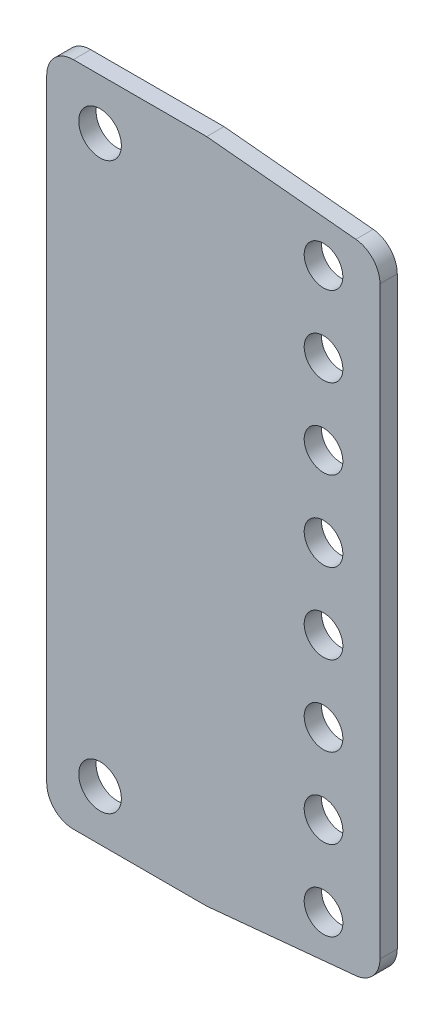
ISO-10303-21;
HEADER;
FILE_DESCRIPTION(('STEP AP214'),'2;1');
FILE_NAME('part.step','',(''),(''),'','','');
FILE_SCHEMA(('AUTOMOTIVE_DESIGN { 1 0 10303 214 1 1 1 1 }'));
ENDSEC;
DATA;
#1=APPLICATION_CONTEXT('core data for automotive mechanical design processes');
#2=APPLICATION_PROTOCOL_DEFINITION('international standard','automotive_design',2000,#1);
#3=PRODUCT_CONTEXT('',#1,'mechanical');
#4=PRODUCT('Part','Part','',(#3));
#5=PRODUCT_RELATED_PRODUCT_CATEGORY('part','',(#4));
#6=PRODUCT_DEFINITION_FORMATION('','',#4);
#7=PRODUCT_DEFINITION_CONTEXT('part definition',#1,'design');
#8=PRODUCT_DEFINITION('design','',#6,#7);
#9=PRODUCT_DEFINITION_SHAPE('','',#8);
#10=(LENGTH_UNIT() NAMED_UNIT(*) SI_UNIT(.MILLI.,.METRE.));
#11=(NAMED_UNIT(*) PLANE_ANGLE_UNIT() SI_UNIT($,.RADIAN.));
#12=(NAMED_UNIT(*) SI_UNIT($,.STERADIAN.) SOLID_ANGLE_UNIT());
#13=UNCERTAINTY_MEASURE_WITH_UNIT(LENGTH_MEASURE(1.E-05),#10,'distance_accuracy_value','');
#14=(GEOMETRIC_REPRESENTATION_CONTEXT(3) GLOBAL_UNCERTAINTY_ASSIGNED_CONTEXT((#13)) GLOBAL_UNIT_ASSIGNED_CONTEXT((#10,
#11,#12)) REPRESENTATION_CONTEXT('',''));
#15=CARTESIAN_POINT('',(0.,0.,0.));
#16=DIRECTION('',(0.,0.,1.));
#17=DIRECTION('',(1.,0.,0.));
#18=AXIS2_PLACEMENT_3D('',#15,#16,#17);
#19=CARTESIAN_POINT('',(0.,0.,1.3));
#20=DIRECTION('',(0.,0.,-1.));
#21=DIRECTION('',(-1.,0.,0.));
#22=AXIS2_PLACEMENT_3D('',#19,#20,#21);
#23=PLANE('',#22);
#24=DIRECTION('',(0.,1.,0.));
#25=VECTOR('',#24,1.);
#26=CARTESIAN_POINT('',(25.,1.25,1.3));
#27=LINE('',#26,#25);
#28=CARTESIAN_POINT('',(25.,3.06691659793984,1.3));
#29=VERTEX_POINT('',#28);
#30=CARTESIAN_POINT('',(25.,46.9330834020602,1.3));
#31=VERTEX_POINT('',#30);
#32=EDGE_CURVE('E173',#29,#31,#27,.T.);
#33=ORIENTED_EDGE('',*,*,#32,.T.);
#34=CARTESIAN_POINT('',(23.,46.9330834020602,1.3));
#35=DIRECTION('',(0.,0.,-1.));
#36=DIRECTION('',(-1.,0.,0.));
#37=AXIS2_PLACEMENT_3D('',#34,#35,#36);
#38=CIRCLE('',#37,2.);
#39=CARTESIAN_POINT('',(23.1914248132885,48.9239014602607,1.3));
#40=VERTEX_POINT('',#39);
#41=EDGE_CURVE('E239',#31,#40,#38,.F.);
#42=ORIENTED_EDGE('',*,*,#41,.T.);
#43=DIRECTION('',(-0.995409029100281,0.0957124066442579,0.));
#44=VECTOR('',#43,1.);
#45=CARTESIAN_POINT('',(12.,50.,1.3));
#46=LINE('',#45,#44);
#47=CARTESIAN_POINT('',(12.,50.,1.3));
#48=VERTEX_POINT('',#47);
#49=EDGE_CURVE('E178',#40,#48,#46,.T.);
#50=ORIENTED_EDGE('',*,*,#49,.T.);
#51=DIRECTION('',(-1.,0.,0.));
#52=VECTOR('',#51,1.);
#53=CARTESIAN_POINT('',(0.,50.,1.3));
#54=LINE('',#53,#52);
#55=CARTESIAN_POINT('',(2.,50.,1.3));
#56=VERTEX_POINT('',#55);
#57=EDGE_CURVE('E184',#48,#56,#54,.T.);
#58=ORIENTED_EDGE('',*,*,#57,.T.);
#59=CARTESIAN_POINT('',(2.,48.,1.3));
#60=DIRECTION('',(0.,0.,-1.));
#61=DIRECTION('',(-1.,0.,0.));
#62=AXIS2_PLACEMENT_3D('',#59,#60,#61);
#63=CIRCLE('',#62,2.);
#64=CARTESIAN_POINT('',(0.,48.,1.3));
#65=VERTEX_POINT('',#64);
#66=EDGE_CURVE('E231',#56,#65,#63,.F.);
#67=ORIENTED_EDGE('',*,*,#66,.T.);
#68=DIRECTION('',(0.,-1.,0.));
#69=VECTOR('',#68,1.);
#70=CARTESIAN_POINT('',(0.,0.,1.3));
#71=LINE('',#70,#69);
#72=CARTESIAN_POINT('',(0.,2.,1.3));
#73=VERTEX_POINT('',#72);
#74=EDGE_CURVE('E159',#65,#73,#71,.T.);
#75=ORIENTED_EDGE('',*,*,#74,.T.);
#76=CARTESIAN_POINT('',(2.,2.,1.3));
#77=DIRECTION('',(0.,0.,-1.));
#78=DIRECTION('',(-1.,0.,0.));
#79=AXIS2_PLACEMENT_3D('',#76,#77,#78);
#80=CIRCLE('',#79,2.);
#81=CARTESIAN_POINT('',(2.,0.,1.3));
#82=VERTEX_POINT('',#81);
#83=EDGE_CURVE('E154',#73,#82,#80,.F.);
#84=ORIENTED_EDGE('',*,*,#83,.T.);
#85=DIRECTION('',(1.,0.,0.));
#86=VECTOR('',#85,1.);
#87=CARTESIAN_POINT('',(0.,0.,1.3));
#88=LINE('',#87,#86);
#89=CARTESIAN_POINT('',(12.,0.,1.3));
#90=VERTEX_POINT('',#89);
#91=EDGE_CURVE('E146',#82,#90,#88,.T.);
#92=ORIENTED_EDGE('',*,*,#91,.T.);
#93=DIRECTION('',(0.995409029100281,0.0957124066442579,0.));
#94=VECTOR('',#93,1.);
#95=CARTESIAN_POINT('',(12.,0.,1.3));
#96=LINE('',#95,#94);
#97=CARTESIAN_POINT('',(23.1914248132885,1.07609853973928,1.3));
#98=VERTEX_POINT('',#97);
#99=EDGE_CURVE('E150',#90,#98,#96,.T.);
#100=ORIENTED_EDGE('',*,*,#99,.T.);
#101=CARTESIAN_POINT('',(23.,3.06691659793984,1.3));
#102=DIRECTION('',(0.,0.,-1.));
#103=DIRECTION('',(-1.,0.,0.));
#104=AXIS2_PLACEMENT_3D('',#101,#102,#103);
#105=CIRCLE('',#104,2.);
#106=EDGE_CURVE('E236',#98,#29,#105,.F.);
#107=ORIENTED_EDGE('',*,*,#106,.T.);
#108=EDGE_LOOP('',(#33,#42,#50,#58,#67,#75,#84,#92,#100,#107));
#109=FACE_BOUND('',#108,.T.);
#110=CARTESIAN_POINT('',(4.00000000000001,46.213205,1.3));
#111=DIRECTION('',(0.,0.,1.));
#112=DIRECTION('',(1.,0.,0.));
#113=AXIS2_PLACEMENT_3D('',#110,#111,#112);
#114=CIRCLE('',#113,1.6);
#115=CARTESIAN_POINT('',(5.6,46.213205,1.3));
#116=VERTEX_POINT('',#115);
#117=EDGE_CURVE('E191',#116,#116,#114,.T.);
#118=ORIENTED_EDGE('',*,*,#117,.F.);
#119=EDGE_LOOP('',(#118));
#120=FACE_BOUND('',#119,.T.);
#121=CARTESIAN_POINT('',(4.00000000000001,3.786795,1.3));
#122=DIRECTION('',(0.,0.,1.));
#123=DIRECTION('',(1.,0.,0.));
#124=AXIS2_PLACEMENT_3D('',#121,#122,#123);
#125=CIRCLE('',#124,1.6);
#126=CARTESIAN_POINT('',(5.6,3.786795,1.3));
#127=VERTEX_POINT('',#126);
#128=EDGE_CURVE('E491',#127,#127,#125,.T.);
#129=ORIENTED_EDGE('',*,*,#128,.F.);
#130=EDGE_LOOP('',(#129));
#131=FACE_BOUND('',#130,.T.);
#132=CARTESIAN_POINT('',(20.766795,46.,1.3));
#133=DIRECTION('',(0.,0.,1.));
#134=DIRECTION('',(1.,0.,0.));
#135=AXIS2_PLACEMENT_3D('',#132,#133,#134);
#136=CIRCLE('',#135,1.45);
#137=CARTESIAN_POINT('',(22.216795,46.,1.3));
#138=VERTEX_POINT('',#137);
#139=EDGE_CURVE('E502',#138,#138,#136,.T.);
#140=ORIENTED_EDGE('',*,*,#139,.F.);
#141=EDGE_LOOP('',(#140));
#142=FACE_BOUND('',#141,.T.);
#143=CARTESIAN_POINT('',(20.766795,4.,1.3));
#144=DIRECTION('',(0.,0.,1.));
#145=DIRECTION('',(1.,0.,0.));
#146=AXIS2_PLACEMENT_3D('',#143,#144,#145);
#147=CIRCLE('',#146,1.45);
#148=CARTESIAN_POINT('',(22.216795,4.,1.3));
#149=VERTEX_POINT('',#148);
#150=EDGE_CURVE('E508',#149,#149,#147,.T.);
#151=ORIENTED_EDGE('',*,*,#150,.F.);
#152=EDGE_LOOP('',(#151));
#153=FACE_BOUND('',#152,.T.);
#154=CARTESIAN_POINT('',(20.7667950000001,40.,1.3));
#155=DIRECTION('',(0.,0.,1.));
#156=DIRECTION('',(1.,0.,0.));
#157=AXIS2_PLACEMENT_3D('',#154,#155,#156);
#158=CIRCLE('',#157,1.45);
#159=CARTESIAN_POINT('',(22.2167950000001,40.,1.3));
#160=VERTEX_POINT('',#159);
#161=EDGE_CURVE('E516',#160,#160,#158,.T.);
#162=ORIENTED_EDGE('',*,*,#161,.F.);
#163=EDGE_LOOP('',(#162));
#164=FACE_BOUND('',#163,.T.);
#165=CARTESIAN_POINT('',(20.7667950000001,34.,1.3));
#166=DIRECTION('',(0.,0.,1.));
#167=DIRECTION('',(1.,0.,0.));
#168=AXIS2_PLACEMENT_3D('',#165,#166,#167);
#169=CIRCLE('',#168,1.45);
#170=CARTESIAN_POINT('',(22.2167950000001,34.,1.3));
#171=VERTEX_POINT('',#170);
#172=EDGE_CURVE('E523',#171,#171,#169,.T.);
#173=ORIENTED_EDGE('',*,*,#172,.F.);
#174=EDGE_LOOP('',(#173));
#175=FACE_BOUND('',#174,.T.);
#176=CARTESIAN_POINT('',(20.7667950000002,28.,1.3));
#177=DIRECTION('',(0.,0.,1.));
#178=DIRECTION('',(1.,0.,0.));
#179=AXIS2_PLACEMENT_3D('',#176,#177,#178);
#180=CIRCLE('',#179,1.45);
#181=CARTESIAN_POINT('',(22.2167950000002,28.,1.3));
#182=VERTEX_POINT('',#181);
#183=EDGE_CURVE('E531',#182,#182,#180,.T.);
#184=ORIENTED_EDGE('',*,*,#183,.F.);
#185=EDGE_LOOP('',(#184));
#186=FACE_BOUND('',#185,.T.);
#187=CARTESIAN_POINT('',(20.7667950000003,22.,1.3));
#188=DIRECTION('',(0.,0.,1.));
#189=DIRECTION('',(1.,0.,0.));
#190=AXIS2_PLACEMENT_3D('',#187,#188,#189);
#191=CIRCLE('',#190,1.45);
#192=CARTESIAN_POINT('',(22.2167950000003,22.,1.3));
#193=VERTEX_POINT('',#192);
#194=EDGE_CURVE('E539',#193,#193,#191,.T.);
#195=ORIENTED_EDGE('',*,*,#194,.F.);
#196=EDGE_LOOP('',(#195));
#197=FACE_BOUND('',#196,.T.);
#198=CARTESIAN_POINT('',(20.7667950000003,16.,1.3));
#199=DIRECTION('',(0.,0.,1.));
#200=DIRECTION('',(1.,0.,0.));
#201=AXIS2_PLACEMENT_3D('',#198,#199,#200);
#202=CIRCLE('',#201,1.45);
#203=CARTESIAN_POINT('',(22.2167950000003,16.,1.3));
#204=VERTEX_POINT('',#203);
#205=EDGE_CURVE('E547',#204,#204,#202,.T.);
#206=ORIENTED_EDGE('',*,*,#205,.F.);
#207=EDGE_LOOP('',(#206));
#208=FACE_BOUND('',#207,.T.);
#209=CARTESIAN_POINT('',(20.7667950000004,9.99999999999999,1.3));
#210=DIRECTION('',(0.,0.,1.));
#211=DIRECTION('',(1.,0.,0.));
#212=AXIS2_PLACEMENT_3D('',#209,#210,#211);
#213=CIRCLE('',#212,1.45);
#214=CARTESIAN_POINT('',(22.2167950000004,9.99999999999999,1.3));
#215=VERTEX_POINT('',#214);
#216=EDGE_CURVE('E555',#215,#215,#213,.T.);
#217=ORIENTED_EDGE('',*,*,#216,.F.);
#218=EDGE_LOOP('',(#217));
#219=FACE_BOUND('',#218,.T.);
#220=ADVANCED_FACE('F47',(#109,#120,#131,#142,#153,#164,#175,#186,#197,#208,#219),#23,.F.);
#221=CARTESIAN_POINT('',(0.,0.,0.));
#222=DIRECTION('',(0.,0.,-1.));
#223=DIRECTION('',(-1.,0.,0.));
#224=AXIS2_PLACEMENT_3D('',#221,#222,#223);
#225=PLANE('',#224);
#226=CARTESIAN_POINT('',(20.7667950000003,16.,0.));
#227=DIRECTION('',(0.,0.,1.));
#228=DIRECTION('',(1.,0.,0.));
#229=AXIS2_PLACEMENT_3D('',#226,#227,#228);
#230=CIRCLE('',#229,1.45);
#231=CARTESIAN_POINT('',(22.2167950000003,16.,0.));
#232=VERTEX_POINT('',#231);
#233=EDGE_CURVE('E551',#232,#232,#230,.T.);
#234=ORIENTED_EDGE('',*,*,#233,.T.);
#235=EDGE_LOOP('',(#234));
#236=FACE_BOUND('',#235,.T.);
#237=CARTESIAN_POINT('',(20.7667950000002,28.,0.));
#238=DIRECTION('',(0.,0.,1.));
#239=DIRECTION('',(1.,0.,0.));
#240=AXIS2_PLACEMENT_3D('',#237,#238,#239);
#241=CIRCLE('',#240,1.45);
#242=CARTESIAN_POINT('',(22.2167950000002,28.,0.));
#243=VERTEX_POINT('',#242);
#244=EDGE_CURVE('E535',#243,#243,#241,.T.);
#245=ORIENTED_EDGE('',*,*,#244,.T.);
#246=EDGE_LOOP('',(#245));
#247=FACE_BOUND('',#246,.T.);
#248=CARTESIAN_POINT('',(20.7667950000001,40.,0.));
#249=DIRECTION('',(0.,0.,1.));
#250=DIRECTION('',(1.,0.,0.));
#251=AXIS2_PLACEMENT_3D('',#248,#249,#250);
#252=CIRCLE('',#251,1.45);
#253=CARTESIAN_POINT('',(22.2167950000001,40.,0.));
#254=VERTEX_POINT('',#253);
#255=EDGE_CURVE('E519',#254,#254,#252,.T.);
#256=ORIENTED_EDGE('',*,*,#255,.T.);
#257=EDGE_LOOP('',(#256));
#258=FACE_BOUND('',#257,.T.);
#259=CARTESIAN_POINT('',(20.766795,46.,0.));
#260=DIRECTION('',(0.,0.,1.));
#261=DIRECTION('',(1.,0.,0.));
#262=AXIS2_PLACEMENT_3D('',#259,#260,#261);
#263=CIRCLE('',#262,1.45);
#264=CARTESIAN_POINT('',(22.216795,46.,0.));
#265=VERTEX_POINT('',#264);
#266=EDGE_CURVE('E504',#265,#265,#263,.T.);
#267=ORIENTED_EDGE('',*,*,#266,.T.);
#268=EDGE_LOOP('',(#267));
#269=FACE_BOUND('',#268,.T.);
#270=CARTESIAN_POINT('',(4.00000000000001,46.213205,0.));
#271=DIRECTION('',(0.,0.,1.));
#272=DIRECTION('',(1.,0.,0.));
#273=AXIS2_PLACEMENT_3D('',#270,#271,#272);
#274=CIRCLE('',#273,1.6);
#275=CARTESIAN_POINT('',(5.6,46.213205,0.));
#276=VERTEX_POINT('',#275);
#277=EDGE_CURVE('E488',#276,#276,#274,.T.);
#278=ORIENTED_EDGE('',*,*,#277,.T.);
#279=EDGE_LOOP('',(#278));
#280=FACE_BOUND('',#279,.T.);
#281=DIRECTION('',(-0.995409029100281,0.0957124066442579,0.));
#282=VECTOR('',#281,1.);
#283=CARTESIAN_POINT('',(12.,50.,0.));
#284=LINE('',#283,#282);
#285=CARTESIAN_POINT('',(23.1914248132885,48.9239014602607,0.));
#286=VERTEX_POINT('',#285);
#287=CARTESIAN_POINT('',(12.,50.,0.));
#288=VERTEX_POINT('',#287);
#289=EDGE_CURVE('E201',#286,#288,#284,.T.);
#290=ORIENTED_EDGE('',*,*,#289,.F.);
#291=CARTESIAN_POINT('',(23.,46.9330834020602,0.));
#292=DIRECTION('',(0.,0.,-1.));
#293=DIRECTION('',(-1.,0.,0.));
#294=AXIS2_PLACEMENT_3D('',#291,#292,#293);
#295=CIRCLE('',#294,2.);
#296=CARTESIAN_POINT('',(25.,46.9330834020602,0.));
#297=VERTEX_POINT('',#296);
#298=EDGE_CURVE('E221',#286,#297,#295,.T.);
#299=ORIENTED_EDGE('',*,*,#298,.T.);
#300=DIRECTION('',(0.,1.,0.));
#301=VECTOR('',#300,1.);
#302=CARTESIAN_POINT('',(25.,1.25,0.));
#303=LINE('',#302,#301);
#304=CARTESIAN_POINT('',(25.,3.06691659793984,0.));
#305=VERTEX_POINT('',#304);
#306=EDGE_CURVE('E197',#305,#297,#303,.T.);
#307=ORIENTED_EDGE('',*,*,#306,.F.);
#308=CARTESIAN_POINT('',(23.,3.06691659793984,0.));
#309=DIRECTION('',(0.,0.,-1.));
#310=DIRECTION('',(-1.,0.,0.));
#311=AXIS2_PLACEMENT_3D('',#308,#309,#310);
#312=CIRCLE('',#311,2.);
#313=CARTESIAN_POINT('',(23.1914248132885,1.07609853973928,0.));
#314=VERTEX_POINT('',#313);
#315=EDGE_CURVE('E219',#305,#314,#312,.T.);
#316=ORIENTED_EDGE('',*,*,#315,.T.);
#317=DIRECTION('',(0.995409029100281,0.0957124066442579,0.));
#318=VECTOR('',#317,1.);
#319=CARTESIAN_POINT('',(12.,0.,0.));
#320=LINE('',#319,#318);
#321=CARTESIAN_POINT('',(12.,0.,0.));
#322=VERTEX_POINT('',#321);
#323=EDGE_CURVE('E194',#322,#314,#320,.T.);
#324=ORIENTED_EDGE('',*,*,#323,.F.);
#325=DIRECTION('',(1.,0.,0.));
#326=VECTOR('',#325,1.);
#327=CARTESIAN_POINT('',(0.,0.,0.));
#328=LINE('',#327,#326);
#329=CARTESIAN_POINT('',(2.,0.,0.));
#330=VERTEX_POINT('',#329);
#331=EDGE_CURVE('E165',#330,#322,#328,.T.);
#332=ORIENTED_EDGE('',*,*,#331,.F.);
#333=CARTESIAN_POINT('',(2.,2.,0.));
#334=DIRECTION('',(0.,0.,-1.));
#335=DIRECTION('',(-1.,0.,0.));
#336=AXIS2_PLACEMENT_3D('',#333,#334,#335);
#337=CIRCLE('',#336,2.);
#338=CARTESIAN_POINT('',(0.,2.,0.));
#339=VERTEX_POINT('',#338);
#340=EDGE_CURVE('E216',#330,#339,#337,.T.);
#341=ORIENTED_EDGE('',*,*,#340,.T.);
#342=DIRECTION('',(0.,-1.,0.));
#343=VECTOR('',#342,1.);
#344=CARTESIAN_POINT('',(0.,0.,0.));
#345=LINE('',#344,#343);
#346=CARTESIAN_POINT('',(0.,48.,0.));
#347=VERTEX_POINT('',#346);
#348=EDGE_CURVE('E187',#347,#339,#345,.T.);
#349=ORIENTED_EDGE('',*,*,#348,.F.);
#350=CARTESIAN_POINT('',(2.,48.,0.));
#351=DIRECTION('',(0.,0.,-1.));
#352=DIRECTION('',(-1.,0.,0.));
#353=AXIS2_PLACEMENT_3D('',#350,#351,#352);
#354=CIRCLE('',#353,2.);
#355=CARTESIAN_POINT('',(2.,50.,0.));
#356=VERTEX_POINT('',#355);
#357=EDGE_CURVE('E213',#347,#356,#354,.T.);
#358=ORIENTED_EDGE('',*,*,#357,.T.);
#359=DIRECTION('',(-1.,0.,0.));
#360=VECTOR('',#359,1.);
#361=CARTESIAN_POINT('',(0.,50.,0.));
#362=LINE('',#361,#360);
#363=EDGE_CURVE('E204',#288,#356,#362,.T.);
#364=ORIENTED_EDGE('',*,*,#363,.F.);
#365=EDGE_LOOP('',(#290,#299,#307,#316,#324,#332,#341,#349,#358,#364));
#366=FACE_BOUND('',#365,.T.);
#367=CARTESIAN_POINT('',(4.00000000000001,3.786795,0.));
#368=DIRECTION('',(0.,0.,1.));
#369=DIRECTION('',(1.,0.,0.));
#370=AXIS2_PLACEMENT_3D('',#367,#368,#369);
#371=CIRCLE('',#370,1.6);
#372=CARTESIAN_POINT('',(5.6,3.786795,0.));
#373=VERTEX_POINT('',#372);
#374=EDGE_CURVE('E497',#373,#373,#371,.T.);
#375=ORIENTED_EDGE('',*,*,#374,.T.);
#376=EDGE_LOOP('',(#375));
#377=FACE_BOUND('',#376,.T.);
#378=CARTESIAN_POINT('',(20.766795,4.,0.));
#379=DIRECTION('',(0.,0.,1.));
#380=DIRECTION('',(1.,0.,0.));
#381=AXIS2_PLACEMENT_3D('',#378,#379,#380);
#382=CIRCLE('',#381,1.45);
#383=CARTESIAN_POINT('',(22.216795,4.,0.));
#384=VERTEX_POINT('',#383);
#385=EDGE_CURVE('E512',#384,#384,#382,.T.);
#386=ORIENTED_EDGE('',*,*,#385,.T.);
#387=EDGE_LOOP('',(#386));
#388=FACE_BOUND('',#387,.T.);
#389=CARTESIAN_POINT('',(20.7667950000001,34.,0.));
#390=DIRECTION('',(0.,0.,1.));
#391=DIRECTION('',(1.,0.,0.));
#392=AXIS2_PLACEMENT_3D('',#389,#390,#391);
#393=CIRCLE('',#392,1.45);
#394=CARTESIAN_POINT('',(22.2167950000001,34.,0.));
#395=VERTEX_POINT('',#394);
#396=EDGE_CURVE('E527',#395,#395,#393,.T.);
#397=ORIENTED_EDGE('',*,*,#396,.T.);
#398=EDGE_LOOP('',(#397));
#399=FACE_BOUND('',#398,.T.);
#400=CARTESIAN_POINT('',(20.7667950000003,22.,0.));
#401=DIRECTION('',(0.,0.,1.));
#402=DIRECTION('',(1.,0.,0.));
#403=AXIS2_PLACEMENT_3D('',#400,#401,#402);
#404=CIRCLE('',#403,1.45);
#405=CARTESIAN_POINT('',(22.2167950000003,22.,0.));
#406=VERTEX_POINT('',#405);
#407=EDGE_CURVE('E543',#406,#406,#404,.T.);
#408=ORIENTED_EDGE('',*,*,#407,.T.);
#409=EDGE_LOOP('',(#408));
#410=FACE_BOUND('',#409,.T.);
#411=CARTESIAN_POINT('',(20.7667950000004,9.99999999999999,0.));
#412=DIRECTION('',(0.,0.,1.));
#413=DIRECTION('',(1.,0.,0.));
#414=AXIS2_PLACEMENT_3D('',#411,#412,#413);
#415=CIRCLE('',#414,1.45);
#416=CARTESIAN_POINT('',(22.2167950000004,9.99999999999999,0.));
#417=VERTEX_POINT('',#416);
#418=EDGE_CURVE('E559',#417,#417,#415,.T.);
#419=ORIENTED_EDGE('',*,*,#418,.T.);
#420=EDGE_LOOP('',(#419));
#421=FACE_BOUND('',#420,.T.);
#422=ADVANCED_FACE('F263',(#236,#247,#258,#269,#280,#366,#377,#388,#399,#410,#421),#225,.T.);
#423=CARTESIAN_POINT('',(0.,0.,1.3));
#424=DIRECTION('',(1.,0.,0.));
#425=DIRECTION('',(0.,0.,-1.));
#426=AXIS2_PLACEMENT_3D('',#423,#424,#425);
#427=PLANE('',#426);
#428=ORIENTED_EDGE('',*,*,#348,.T.);
#429=DIRECTION('',(0.,0.,-1.));
#430=VECTOR('',#429,1.);
#431=CARTESIAN_POINT('',(0.,2.,1.3));
#432=LINE('',#431,#430);
#433=EDGE_CURVE('E56',#339,#73,#432,.F.);
#434=ORIENTED_EDGE('',*,*,#433,.T.);
#435=ORIENTED_EDGE('',*,*,#74,.F.);
#436=DIRECTION('',(0.,0.,-1.));
#437=VECTOR('',#436,1.);
#438=CARTESIAN_POINT('',(0.,48.,1.3));
#439=LINE('',#438,#437);
#440=EDGE_CURVE('E247',#65,#347,#439,.T.);
#441=ORIENTED_EDGE('',*,*,#440,.T.);
#442=EDGE_LOOP('',(#428,#434,#435,#441));
#443=FACE_BOUND('',#442,.T.);
#444=ADVANCED_FACE('F255',(#443),#427,.F.);
#445=CARTESIAN_POINT('',(0.,0.,1.3));
#446=DIRECTION('',(0.,1.,0.));
#447=DIRECTION('',(0.,0.,1.));
#448=AXIS2_PLACEMENT_3D('',#445,#446,#447);
#449=PLANE('',#448);
#450=ORIENTED_EDGE('',*,*,#91,.F.);
#451=DIRECTION('',(0.,0.,-1.));
#452=VECTOR('',#451,1.);
#453=CARTESIAN_POINT('',(2.,0.,1.3));
#454=LINE('',#453,#452);
#455=EDGE_CURVE('E244',#82,#330,#454,.T.);
#456=ORIENTED_EDGE('',*,*,#455,.T.);
#457=ORIENTED_EDGE('',*,*,#331,.T.);
#458=DIRECTION('',(0.,0.,-1.));
#459=VECTOR('',#458,1.);
#460=CARTESIAN_POINT('',(12.,0.,1.3));
#461=LINE('',#460,#459);
#462=EDGE_CURVE('E162',#90,#322,#461,.T.);
#463=ORIENTED_EDGE('',*,*,#462,.F.);
#464=EDGE_LOOP('',(#450,#456,#457,#463));
#465=FACE_BOUND('',#464,.T.);
#466=ADVANCED_FACE('F163',(#465),#449,.F.);
#467=CARTESIAN_POINT('',(12.,0.,1.3));
#468=DIRECTION('',(-0.0957124066442579,0.995409029100281,0.));
#469=DIRECTION('',(-0.995409029100281,-0.0957124066442579,0.));
#470=AXIS2_PLACEMENT_3D('',#467,#468,#469);
#471=PLANE('',#470);
#472=ORIENTED_EDGE('',*,*,#323,.T.);
#473=DIRECTION('',(0.,0.,-1.));
#474=VECTOR('',#473,1.);
#475=CARTESIAN_POINT('',(23.1914248132885,1.07609853973928,1.3));
#476=LINE('',#475,#474);
#477=EDGE_CURVE('E75',#314,#98,#476,.F.);
#478=ORIENTED_EDGE('',*,*,#477,.T.);
#479=ORIENTED_EDGE('',*,*,#99,.F.);
#480=ORIENTED_EDGE('',*,*,#462,.T.);
#481=EDGE_LOOP('',(#472,#478,#479,#480));
#482=FACE_BOUND('',#481,.T.);
#483=ADVANCED_FACE('F171',(#482),#471,.F.);
#484=CARTESIAN_POINT('',(25.,1.25,1.3));
#485=DIRECTION('',(-1.,0.,0.));
#486=DIRECTION('',(0.,0.,1.));
#487=AXIS2_PLACEMENT_3D('',#484,#485,#486);
#488=PLANE('',#487);
#489=ORIENTED_EDGE('',*,*,#306,.T.);
#490=DIRECTION('',(0.,0.,-1.));
#491=VECTOR('',#490,1.);
#492=CARTESIAN_POINT('',(25.,46.9330834020602,1.3));
#493=LINE('',#492,#491);
#494=EDGE_CURVE('E228',#297,#31,#493,.F.);
#495=ORIENTED_EDGE('',*,*,#494,.T.);
#496=ORIENTED_EDGE('',*,*,#32,.F.);
#497=DIRECTION('',(0.,0.,-1.));
#498=VECTOR('',#497,1.);
#499=CARTESIAN_POINT('',(25.,3.06691659793984,1.3));
#500=LINE('',#499,#498);
#501=EDGE_CURVE('E224',#29,#305,#500,.T.);
#502=ORIENTED_EDGE('',*,*,#501,.T.);
#503=EDGE_LOOP('',(#489,#495,#496,#502));
#504=FACE_BOUND('',#503,.T.);
#505=ADVANCED_FACE('F272',(#504),#488,.F.);
#506=CARTESIAN_POINT('',(12.,50.,1.3));
#507=DIRECTION('',(-0.0957124066442579,-0.995409029100281,0.));
#508=DIRECTION('',(0.995409029100281,-0.0957124066442579,0.));
#509=AXIS2_PLACEMENT_3D('',#506,#507,#508);
#510=PLANE('',#509);
#511=ORIENTED_EDGE('',*,*,#49,.F.);
#512=DIRECTION('',(0.,0.,-1.));
#513=VECTOR('',#512,1.);
#514=CARTESIAN_POINT('',(23.1914248132885,48.9239014602607,1.3));
#515=LINE('',#514,#513);
#516=EDGE_CURVE('E168',#40,#286,#515,.T.);
#517=ORIENTED_EDGE('',*,*,#516,.T.);
#518=ORIENTED_EDGE('',*,*,#289,.T.);
#519=DIRECTION('',(0.,0.,-1.));
#520=VECTOR('',#519,1.);
#521=CARTESIAN_POINT('',(12.,50.,1.3));
#522=LINE('',#521,#520);
#523=EDGE_CURVE('E169',#48,#288,#522,.T.);
#524=ORIENTED_EDGE('',*,*,#523,.F.);
#525=EDGE_LOOP('',(#511,#517,#518,#524));
#526=FACE_BOUND('',#525,.T.);
#527=ADVANCED_FACE('F280',(#526),#510,.F.);
#528=CARTESIAN_POINT('',(0.,50.,1.3));
#529=DIRECTION('',(0.,-1.,0.));
#530=DIRECTION('',(0.,0.,-1.));
#531=AXIS2_PLACEMENT_3D('',#528,#529,#530);
#532=PLANE('',#531);
#533=ORIENTED_EDGE('',*,*,#363,.T.);
#534=DIRECTION('',(0.,0.,-1.));
#535=VECTOR('',#534,1.);
#536=CARTESIAN_POINT('',(2.,50.,1.3));
#537=LINE('',#536,#535);
#538=EDGE_CURVE('E11',#356,#56,#537,.F.);
#539=ORIENTED_EDGE('',*,*,#538,.T.);
#540=ORIENTED_EDGE('',*,*,#57,.F.);
#541=ORIENTED_EDGE('',*,*,#523,.T.);
#542=EDGE_LOOP('',(#533,#539,#540,#541));
#543=FACE_BOUND('',#542,.T.);
#544=ADVANCED_FACE('F282',(#543),#532,.F.);
#545=CARTESIAN_POINT('',(4.00000000000001,46.213205,1.3));
#546=DIRECTION('',(0.,0.,-1.));
#547=DIRECTION('',(-1.,0.,0.));
#548=AXIS2_PLACEMENT_3D('',#545,#546,#547);
#549=CYLINDRICAL_SURFACE('',#548,1.6);
#550=ORIENTED_EDGE('',*,*,#117,.T.);
#551=EDGE_LOOP('',(#550));
#552=FACE_BOUND('',#551,.T.);
#553=ORIENTED_EDGE('',*,*,#277,.F.);
#554=EDGE_LOOP('',(#553));
#555=FACE_BOUND('',#554,.T.);
#556=ADVANCED_FACE('F295',(#552,#555),#549,.F.);
#557=CARTESIAN_POINT('',(4.00000000000001,3.786795,1.3));
#558=DIRECTION('',(0.,0.,-1.));
#559=DIRECTION('',(-1.,0.,0.));
#560=AXIS2_PLACEMENT_3D('',#557,#558,#559);
#561=CYLINDRICAL_SURFACE('',#560,1.6);
#562=ORIENTED_EDGE('',*,*,#128,.T.);
#563=EDGE_LOOP('',(#562));
#564=FACE_BOUND('',#563,.T.);
#565=ORIENTED_EDGE('',*,*,#374,.F.);
#566=EDGE_LOOP('',(#565));
#567=FACE_BOUND('',#566,.T.);
#568=ADVANCED_FACE('F404',(#564,#567),#561,.F.);
#569=CARTESIAN_POINT('',(20.766795,46.,1.3));
#570=DIRECTION('',(0.,0.,-1.));
#571=DIRECTION('',(-1.,0.,0.));
#572=AXIS2_PLACEMENT_3D('',#569,#570,#571);
#573=CYLINDRICAL_SURFACE('',#572,1.45);
#574=ORIENTED_EDGE('',*,*,#139,.T.);
#575=EDGE_LOOP('',(#574));
#576=FACE_BOUND('',#575,.T.);
#577=ORIENTED_EDGE('',*,*,#266,.F.);
#578=EDGE_LOOP('',(#577));
#579=FACE_BOUND('',#578,.T.);
#580=ADVANCED_FACE('F395',(#576,#579),#573,.F.);
#581=CARTESIAN_POINT('',(20.766795,4.,1.3));
#582=DIRECTION('',(0.,0.,-1.));
#583=DIRECTION('',(-1.,0.,0.));
#584=AXIS2_PLACEMENT_3D('',#581,#582,#583);
#585=CYLINDRICAL_SURFACE('',#584,1.45);
#586=ORIENTED_EDGE('',*,*,#150,.T.);
#587=EDGE_LOOP('',(#586));
#588=FACE_BOUND('',#587,.T.);
#589=ORIENTED_EDGE('',*,*,#385,.F.);
#590=EDGE_LOOP('',(#589));
#591=FACE_BOUND('',#590,.T.);
#592=ADVANCED_FACE('F386',(#588,#591),#585,.F.);
#593=CARTESIAN_POINT('',(20.7667950000001,40.,1.3));
#594=DIRECTION('',(0.,0.,-1.));
#595=DIRECTION('',(-1.,0.,0.));
#596=AXIS2_PLACEMENT_3D('',#593,#594,#595);
#597=CYLINDRICAL_SURFACE('',#596,1.45);
#598=ORIENTED_EDGE('',*,*,#161,.T.);
#599=EDGE_LOOP('',(#598));
#600=FACE_BOUND('',#599,.T.);
#601=ORIENTED_EDGE('',*,*,#255,.F.);
#602=EDGE_LOOP('',(#601));
#603=FACE_BOUND('',#602,.T.);
#604=ADVANCED_FACE('F377',(#600,#603),#597,.F.);
#605=CARTESIAN_POINT('',(20.7667950000001,34.,1.3));
#606=DIRECTION('',(0.,0.,-1.));
#607=DIRECTION('',(-1.,0.,0.));
#608=AXIS2_PLACEMENT_3D('',#605,#606,#607);
#609=CYLINDRICAL_SURFACE('',#608,1.45);
#610=ORIENTED_EDGE('',*,*,#172,.T.);
#611=EDGE_LOOP('',(#610));
#612=FACE_BOUND('',#611,.T.);
#613=ORIENTED_EDGE('',*,*,#396,.F.);
#614=EDGE_LOOP('',(#613));
#615=FACE_BOUND('',#614,.T.);
#616=ADVANCED_FACE('F368',(#612,#615),#609,.F.);
#617=CARTESIAN_POINT('',(20.7667950000002,28.,1.3));
#618=DIRECTION('',(0.,0.,-1.));
#619=DIRECTION('',(-1.,0.,0.));
#620=AXIS2_PLACEMENT_3D('',#617,#618,#619);
#621=CYLINDRICAL_SURFACE('',#620,1.45);
#622=ORIENTED_EDGE('',*,*,#183,.T.);
#623=EDGE_LOOP('',(#622));
#624=FACE_BOUND('',#623,.T.);
#625=ORIENTED_EDGE('',*,*,#244,.F.);
#626=EDGE_LOOP('',(#625));
#627=FACE_BOUND('',#626,.T.);
#628=ADVANCED_FACE('F359',(#624,#627),#621,.F.);
#629=CARTESIAN_POINT('',(20.7667950000003,22.,1.3));
#630=DIRECTION('',(0.,0.,-1.));
#631=DIRECTION('',(-1.,0.,0.));
#632=AXIS2_PLACEMENT_3D('',#629,#630,#631);
#633=CYLINDRICAL_SURFACE('',#632,1.45);
#634=ORIENTED_EDGE('',*,*,#194,.T.);
#635=EDGE_LOOP('',(#634));
#636=FACE_BOUND('',#635,.T.);
#637=ORIENTED_EDGE('',*,*,#407,.F.);
#638=EDGE_LOOP('',(#637));
#639=FACE_BOUND('',#638,.T.);
#640=ADVANCED_FACE('F350',(#636,#639),#633,.F.);
#641=CARTESIAN_POINT('',(20.7667950000003,16.,1.3));
#642=DIRECTION('',(0.,0.,-1.));
#643=DIRECTION('',(-1.,0.,0.));
#644=AXIS2_PLACEMENT_3D('',#641,#642,#643);
#645=CYLINDRICAL_SURFACE('',#644,1.45);
#646=ORIENTED_EDGE('',*,*,#205,.T.);
#647=EDGE_LOOP('',(#646));
#648=FACE_BOUND('',#647,.T.);
#649=ORIENTED_EDGE('',*,*,#233,.F.);
#650=EDGE_LOOP('',(#649));
#651=FACE_BOUND('',#650,.T.);
#652=ADVANCED_FACE('F341',(#648,#651),#645,.F.);
#653=CARTESIAN_POINT('',(20.7667950000004,9.99999999999999,1.3));
#654=DIRECTION('',(0.,0.,-1.));
#655=DIRECTION('',(-1.,0.,0.));
#656=AXIS2_PLACEMENT_3D('',#653,#654,#655);
#657=CYLINDRICAL_SURFACE('',#656,1.45);
#658=ORIENTED_EDGE('',*,*,#216,.T.);
#659=EDGE_LOOP('',(#658));
#660=FACE_BOUND('',#659,.T.);
#661=ORIENTED_EDGE('',*,*,#418,.F.);
#662=EDGE_LOOP('',(#661));
#663=FACE_BOUND('',#662,.T.);
#664=ADVANCED_FACE('F312',(#660,#663),#657,.F.);
#665=CARTESIAN_POINT('',(23.,46.9330834020602,1.3));
#666=DIRECTION('',(0.,0.,-1.));
#667=DIRECTION('',(-1.,0.,0.));
#668=AXIS2_PLACEMENT_3D('',#665,#666,#667);
#669=CYLINDRICAL_SURFACE('',#668,2.);
#670=ORIENTED_EDGE('',*,*,#41,.F.);
#671=ORIENTED_EDGE('',*,*,#494,.F.);
#672=ORIENTED_EDGE('',*,*,#298,.F.);
#673=ORIENTED_EDGE('',*,*,#516,.F.);
#674=EDGE_LOOP('',(#670,#671,#672,#673));
#675=FACE_BOUND('',#674,.T.);
#676=ADVANCED_FACE('F275',(#675),#669,.T.);
#677=CARTESIAN_POINT('',(23.,3.06691659793984,1.3));
#678=DIRECTION('',(0.,0.,-1.));
#679=DIRECTION('',(-1.,0.,0.));
#680=AXIS2_PLACEMENT_3D('',#677,#678,#679);
#681=CYLINDRICAL_SURFACE('',#680,2.);
#682=ORIENTED_EDGE('',*,*,#106,.F.);
#683=ORIENTED_EDGE('',*,*,#477,.F.);
#684=ORIENTED_EDGE('',*,*,#315,.F.);
#685=ORIENTED_EDGE('',*,*,#501,.F.);
#686=EDGE_LOOP('',(#682,#683,#684,#685));
#687=FACE_BOUND('',#686,.T.);
#688=ADVANCED_FACE('F267',(#687),#681,.T.);
#689=CARTESIAN_POINT('',(2.,2.,1.3));
#690=DIRECTION('',(0.,0.,-1.));
#691=DIRECTION('',(-1.,0.,0.));
#692=AXIS2_PLACEMENT_3D('',#689,#690,#691);
#693=CYLINDRICAL_SURFACE('',#692,2.);
#694=ORIENTED_EDGE('',*,*,#83,.F.);
#695=ORIENTED_EDGE('',*,*,#433,.F.);
#696=ORIENTED_EDGE('',*,*,#340,.F.);
#697=ORIENTED_EDGE('',*,*,#455,.F.);
#698=EDGE_LOOP('',(#694,#695,#696,#697));
#699=FACE_BOUND('',#698,.T.);
#700=ADVANCED_FACE('F260',(#699),#693,.T.);
#701=CARTESIAN_POINT('',(2.,48.,1.3));
#702=DIRECTION('',(0.,0.,-1.));
#703=DIRECTION('',(-1.,0.,0.));
#704=AXIS2_PLACEMENT_3D('',#701,#702,#703);
#705=CYLINDRICAL_SURFACE('',#704,2.);
#706=ORIENTED_EDGE('',*,*,#66,.F.);
#707=ORIENTED_EDGE('',*,*,#538,.F.);
#708=ORIENTED_EDGE('',*,*,#357,.F.);
#709=ORIENTED_EDGE('',*,*,#440,.F.);
#710=EDGE_LOOP('',(#706,#707,#708,#709));
#711=FACE_BOUND('',#710,.T.);
#712=ADVANCED_FACE('F49',(#711),#705,.T.);
#713=CLOSED_SHELL('',(#220,#422,#444,#466,#483,#505,#527,#544,#556,#568,#580,#592,#604,#616,
#628,#640,#652,#664,#676,#688,#700,#712));
#714=MANIFOLD_SOLID_BREP('B2',#713);
#715=ADVANCED_BREP_SHAPE_REPRESENTATION('',(#18,#714),#14);
#716=SHAPE_DEFINITION_REPRESENTATION(#9,#715);
ENDSEC;
END-ISO-10303-21;
